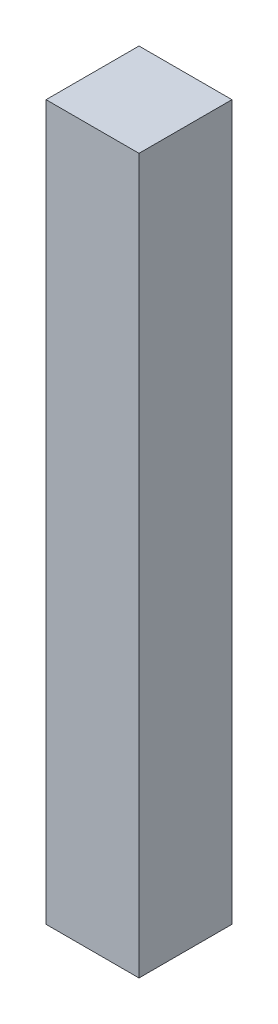
ISO-10303-21;
HEADER;
FILE_DESCRIPTION(('STEP AP214'),'2;1');
FILE_NAME('part.step','',(''),(''),'','','');
FILE_SCHEMA(('AUTOMOTIVE_DESIGN { 1 0 10303 214 1 1 1 1 }'));
ENDSEC;
DATA;
#1=APPLICATION_CONTEXT('core data for automotive mechanical design processes');
#2=APPLICATION_PROTOCOL_DEFINITION('international standard','automotive_design',2000,#1);
#3=PRODUCT_CONTEXT('',#1,'mechanical');
#4=PRODUCT('Part','Part','',(#3));
#5=PRODUCT_RELATED_PRODUCT_CATEGORY('part','',(#4));
#6=PRODUCT_DEFINITION_FORMATION('','',#4);
#7=PRODUCT_DEFINITION_CONTEXT('part definition',#1,'design');
#8=PRODUCT_DEFINITION('design','',#6,#7);
#9=PRODUCT_DEFINITION_SHAPE('','',#8);
#10=(LENGTH_UNIT() NAMED_UNIT(*) SI_UNIT(.MILLI.,.METRE.));
#11=(NAMED_UNIT(*) PLANE_ANGLE_UNIT() SI_UNIT($,.RADIAN.));
#12=(NAMED_UNIT(*) SI_UNIT($,.STERADIAN.) SOLID_ANGLE_UNIT());
#13=UNCERTAINTY_MEASURE_WITH_UNIT(LENGTH_MEASURE(1.E-05),#10,'distance_accuracy_value','');
#14=(GEOMETRIC_REPRESENTATION_CONTEXT(3) GLOBAL_UNCERTAINTY_ASSIGNED_CONTEXT((#13)) GLOBAL_UNIT_ASSIGNED_CONTEXT((#10,
#11,#12)) REPRESENTATION_CONTEXT('',''));
#15=CARTESIAN_POINT('',(0.,0.,0.));
#16=DIRECTION('',(0.,0.,1.));
#17=DIRECTION('',(1.,0.,0.));
#18=AXIS2_PLACEMENT_3D('',#15,#16,#17);
#19=CARTESIAN_POINT('',(19.,-146.,19.));
#20=DIRECTION('',(1.,0.,0.));
#21=DIRECTION('',(0.,0.,-1.));
#22=AXIS2_PLACEMENT_3D('',#19,#20,#21);
#23=PLANE('',#22);
#24=DIRECTION('',(0.,1.,0.));
#25=VECTOR('',#24,1.);
#26=CARTESIAN_POINT('',(19.,-146.,-19.));
#27=LINE('',#26,#25);
#28=CARTESIAN_POINT('',(19.,-146.,-19.));
#29=VERTEX_POINT('',#28);
#30=CARTESIAN_POINT('',(19.,146.,-19.));
#31=VERTEX_POINT('',#30);
#32=EDGE_CURVE('E42',#29,#31,#27,.T.);
#33=ORIENTED_EDGE('',*,*,#32,.T.);
#34=DIRECTION('',(0.,0.,-1.));
#35=VECTOR('',#34,1.);
#36=CARTESIAN_POINT('',(19.,146.,19.));
#37=LINE('',#36,#35);
#38=CARTESIAN_POINT('',(19.,146.,19.));
#39=VERTEX_POINT('',#38);
#40=EDGE_CURVE('E80',#39,#31,#37,.T.);
#41=ORIENTED_EDGE('',*,*,#40,.F.);
#42=DIRECTION('',(0.,1.,0.));
#43=VECTOR('',#42,1.);
#44=CARTESIAN_POINT('',(19.,-146.,19.));
#45=LINE('',#44,#43);
#46=CARTESIAN_POINT('',(19.,-146.,19.));
#47=VERTEX_POINT('',#46);
#48=EDGE_CURVE('E11',#47,#39,#45,.T.);
#49=ORIENTED_EDGE('',*,*,#48,.F.);
#50=DIRECTION('',(0.,0.,-1.));
#51=VECTOR('',#50,1.);
#52=CARTESIAN_POINT('',(19.,-146.,19.));
#53=LINE('',#52,#51);
#54=EDGE_CURVE('E81',#47,#29,#53,.T.);
#55=ORIENTED_EDGE('',*,*,#54,.T.);
#56=EDGE_LOOP('',(#33,#41,#49,#55));
#57=FACE_BOUND('',#56,.T.);
#58=ADVANCED_FACE('F39',(#57),#23,.T.);
#59=CARTESIAN_POINT('',(-19.,-146.,19.));
#60=DIRECTION('',(0.,0.,1.));
#61=DIRECTION('',(1.,0.,0.));
#62=AXIS2_PLACEMENT_3D('',#59,#60,#61);
#63=PLANE('',#62);
#64=ORIENTED_EDGE('',*,*,#48,.T.);
#65=DIRECTION('',(1.,0.,0.));
#66=VECTOR('',#65,1.);
#67=CARTESIAN_POINT('',(-19.,146.,19.));
#68=LINE('',#67,#66);
#69=CARTESIAN_POINT('',(-19.,146.,19.));
#70=VERTEX_POINT('',#69);
#71=EDGE_CURVE('E99',#70,#39,#68,.T.);
#72=ORIENTED_EDGE('',*,*,#71,.F.);
#73=DIRECTION('',(0.,1.,0.));
#74=VECTOR('',#73,1.);
#75=CARTESIAN_POINT('',(-19.,-146.,19.));
#76=LINE('',#75,#74);
#77=CARTESIAN_POINT('',(-19.,-146.,19.));
#78=VERTEX_POINT('',#77);
#79=EDGE_CURVE('E48',#78,#70,#76,.T.);
#80=ORIENTED_EDGE('',*,*,#79,.F.);
#81=DIRECTION('',(1.,0.,0.));
#82=VECTOR('',#81,1.);
#83=CARTESIAN_POINT('',(-19.,-146.,19.));
#84=LINE('',#83,#82);
#85=EDGE_CURVE('E87',#78,#47,#84,.T.);
#86=ORIENTED_EDGE('',*,*,#85,.T.);
#87=EDGE_LOOP('',(#64,#72,#80,#86));
#88=FACE_BOUND('',#87,.T.);
#89=ADVANCED_FACE('F123',(#88),#63,.T.);
#90=CARTESIAN_POINT('',(-19.,-146.,19.));
#91=DIRECTION('',(-1.,0.,0.));
#92=DIRECTION('',(0.,0.,1.));
#93=AXIS2_PLACEMENT_3D('',#90,#91,#92);
#94=PLANE('',#93);
#95=ORIENTED_EDGE('',*,*,#79,.T.);
#96=DIRECTION('',(0.,0.,1.));
#97=VECTOR('',#96,1.);
#98=CARTESIAN_POINT('',(-19.,146.,19.));
#99=LINE('',#98,#97);
#100=CARTESIAN_POINT('',(-19.,146.,-19.));
#101=VERTEX_POINT('',#100);
#102=EDGE_CURVE('E95',#101,#70,#99,.T.);
#103=ORIENTED_EDGE('',*,*,#102,.F.);
#104=DIRECTION('',(0.,1.,0.));
#105=VECTOR('',#104,1.);
#106=CARTESIAN_POINT('',(-19.,-146.,-19.));
#107=LINE('',#106,#105);
#108=CARTESIAN_POINT('',(-19.,-146.,-19.));
#109=VERTEX_POINT('',#108);
#110=EDGE_CURVE('E86',#109,#101,#107,.T.);
#111=ORIENTED_EDGE('',*,*,#110,.F.);
#112=DIRECTION('',(0.,0.,1.));
#113=VECTOR('',#112,1.);
#114=CARTESIAN_POINT('',(-19.,-146.,19.));
#115=LINE('',#114,#113);
#116=EDGE_CURVE('E112',#109,#78,#115,.T.);
#117=ORIENTED_EDGE('',*,*,#116,.T.);
#118=EDGE_LOOP('',(#95,#103,#111,#117));
#119=FACE_BOUND('',#118,.T.);
#120=ADVANCED_FACE('F120',(#119),#94,.T.);
#121=CARTESIAN_POINT('',(-19.,-146.,-19.));
#122=DIRECTION('',(0.,0.,-1.));
#123=DIRECTION('',(-1.,0.,0.));
#124=AXIS2_PLACEMENT_3D('',#121,#122,#123);
#125=PLANE('',#124);
#126=ORIENTED_EDGE('',*,*,#110,.T.);
#127=DIRECTION('',(-1.,0.,0.));
#128=VECTOR('',#127,1.);
#129=CARTESIAN_POINT('',(-19.,146.,-19.));
#130=LINE('',#129,#128);
#131=EDGE_CURVE('E89',#31,#101,#130,.T.);
#132=ORIENTED_EDGE('',*,*,#131,.F.);
#133=ORIENTED_EDGE('',*,*,#32,.F.);
#134=DIRECTION('',(-1.,0.,0.));
#135=VECTOR('',#134,1.);
#136=CARTESIAN_POINT('',(-19.,-146.,-19.));
#137=LINE('',#136,#135);
#138=EDGE_CURVE('E109',#29,#109,#137,.T.);
#139=ORIENTED_EDGE('',*,*,#138,.T.);
#140=EDGE_LOOP('',(#126,#132,#133,#139));
#141=FACE_BOUND('',#140,.T.);
#142=ADVANCED_FACE('F90',(#141),#125,.T.);
#143=CARTESIAN_POINT('',(0.,-146.,0.));
#144=DIRECTION('',(0.,-1.,0.));
#145=DIRECTION('',(0.,0.,-1.));
#146=AXIS2_PLACEMENT_3D('',#143,#144,#145);
#147=PLANE('',#146);
#148=ORIENTED_EDGE('',*,*,#54,.F.);
#149=ORIENTED_EDGE('',*,*,#85,.F.);
#150=ORIENTED_EDGE('',*,*,#116,.F.);
#151=ORIENTED_EDGE('',*,*,#138,.F.);
#152=EDGE_LOOP('',(#148,#149,#150,#151));
#153=FACE_BOUND('',#152,.T.);
#154=ADVANCED_FACE('F125',(#153),#147,.T.);
#155=CARTESIAN_POINT('',(0.,146.,0.));
#156=DIRECTION('',(0.,-1.,0.));
#157=DIRECTION('',(0.,0.,-1.));
#158=AXIS2_PLACEMENT_3D('',#155,#156,#157);
#159=PLANE('',#158);
#160=ORIENTED_EDGE('',*,*,#40,.T.);
#161=ORIENTED_EDGE('',*,*,#131,.T.);
#162=ORIENTED_EDGE('',*,*,#102,.T.);
#163=ORIENTED_EDGE('',*,*,#71,.T.);
#164=EDGE_LOOP('',(#160,#161,#162,#163));
#165=FACE_BOUND('',#164,.T.);
#166=ADVANCED_FACE('F98',(#165),#159,.F.);
#167=CLOSED_SHELL('',(#58,#89,#120,#142,#154,#166));
#168=MANIFOLD_SOLID_BREP('B2',#167);
#169=ADVANCED_BREP_SHAPE_REPRESENTATION('',(#18,#168),#14);
#170=SHAPE_DEFINITION_REPRESENTATION(#9,#169);
ENDSEC;
END-ISO-10303-21;
